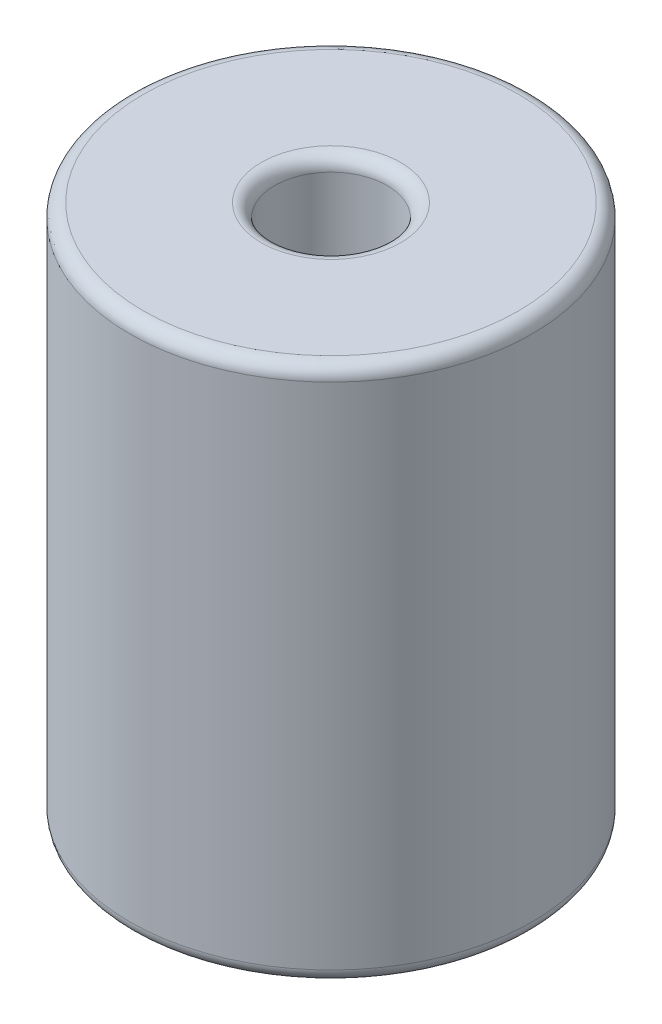
ISO-10303-21;
HEADER;
FILE_DESCRIPTION(('STEP AP214'),'2;1');
FILE_NAME('part.step','',(''),(''),'','','');
FILE_SCHEMA(('AUTOMOTIVE_DESIGN { 1 0 10303 214 1 1 1 1 }'));
ENDSEC;
DATA;
#1=APPLICATION_CONTEXT('core data for automotive mechanical design processes');
#2=APPLICATION_PROTOCOL_DEFINITION('international standard','automotive_design',2000,#1);
#3=PRODUCT_CONTEXT('',#1,'mechanical');
#4=PRODUCT('Part','Part','',(#3));
#5=PRODUCT_RELATED_PRODUCT_CATEGORY('part','',(#4));
#6=PRODUCT_DEFINITION_FORMATION('','',#4);
#7=PRODUCT_DEFINITION_CONTEXT('part definition',#1,'design');
#8=PRODUCT_DEFINITION('design','',#6,#7);
#9=PRODUCT_DEFINITION_SHAPE('','',#8);
#10=(LENGTH_UNIT() NAMED_UNIT(*) SI_UNIT(.MILLI.,.METRE.));
#11=(NAMED_UNIT(*) PLANE_ANGLE_UNIT() SI_UNIT($,.RADIAN.));
#12=(NAMED_UNIT(*) SI_UNIT($,.STERADIAN.) SOLID_ANGLE_UNIT());
#13=UNCERTAINTY_MEASURE_WITH_UNIT(LENGTH_MEASURE(1.E-05),#10,'distance_accuracy_value','');
#14=(GEOMETRIC_REPRESENTATION_CONTEXT(3) GLOBAL_UNCERTAINTY_ASSIGNED_CONTEXT((#13)) GLOBAL_UNIT_ASSIGNED_CONTEXT((#10,
#11,#12)) REPRESENTATION_CONTEXT('',''));
#15=CARTESIAN_POINT('',(0.,0.,0.));
#16=DIRECTION('',(0.,0.,1.));
#17=DIRECTION('',(1.,0.,0.));
#18=AXIS2_PLACEMENT_3D('',#15,#16,#17);
#19=CARTESIAN_POINT('',(0.,20.,0.));
#20=DIRECTION('',(0.,1.,0.));
#21=DIRECTION('',(0.,0.,1.));
#22=AXIS2_PLACEMENT_3D('',#19,#20,#21);
#23=PLANE('',#22);
#24=CARTESIAN_POINT('',(0.,20.,0.));
#25=DIRECTION('',(0.,1.,0.));
#26=DIRECTION('',(0.,0.,1.));
#27=AXIS2_PLACEMENT_3D('',#24,#25,#26);
#28=CIRCLE('',#27,2.6);
#29=CARTESIAN_POINT('',(0.,20.,2.6));
#30=VERTEX_POINT('',#29);
#31=EDGE_CURVE('E42',#30,#30,#28,.F.);
#32=ORIENTED_EDGE('',*,*,#31,.T.);
#33=EDGE_LOOP('',(#32));
#34=FACE_BOUND('',#33,.T.);
#35=CARTESIAN_POINT('',(0.,20.,0.));
#36=DIRECTION('',(0.,1.,0.));
#37=DIRECTION('',(0.,0.,1.));
#38=AXIS2_PLACEMENT_3D('',#35,#36,#37);
#39=CIRCLE('',#38,7.);
#40=CARTESIAN_POINT('',(0.,20.,7.));
#41=VERTEX_POINT('',#40);
#42=EDGE_CURVE('E46',#41,#41,#39,.T.);
#43=ORIENTED_EDGE('',*,*,#42,.T.);
#44=EDGE_LOOP('',(#43));
#45=FACE_BOUND('',#44,.T.);
#46=ADVANCED_FACE('F31',(#34,#45),#23,.T.);
#47=CARTESIAN_POINT('',(0.,0.,0.));
#48=DIRECTION('',(0.,1.,0.));
#49=DIRECTION('',(0.,0.,1.));
#50=AXIS2_PLACEMENT_3D('',#47,#48,#49);
#51=PLANE('',#50);
#52=CARTESIAN_POINT('',(0.,0.,0.));
#53=DIRECTION('',(0.,1.,0.));
#54=DIRECTION('',(0.,0.,1.));
#55=AXIS2_PLACEMENT_3D('',#52,#53,#54);
#56=CIRCLE('',#55,2.6);
#57=CARTESIAN_POINT('',(0.,0.,2.6));
#58=VERTEX_POINT('',#57);
#59=EDGE_CURVE('E57',#58,#58,#56,.T.);
#60=ORIENTED_EDGE('',*,*,#59,.T.);
#61=EDGE_LOOP('',(#60));
#62=FACE_BOUND('',#61,.T.);
#63=CARTESIAN_POINT('',(0.,0.,0.));
#64=DIRECTION('',(0.,1.,0.));
#65=DIRECTION('',(0.,0.,1.));
#66=AXIS2_PLACEMENT_3D('',#63,#64,#65);
#67=CIRCLE('',#66,7.);
#68=CARTESIAN_POINT('',(0.,0.,7.));
#69=VERTEX_POINT('',#68);
#70=EDGE_CURVE('E60',#69,#69,#67,.F.);
#71=ORIENTED_EDGE('',*,*,#70,.T.);
#72=EDGE_LOOP('',(#71));
#73=FACE_BOUND('',#72,.T.);
#74=ADVANCED_FACE('F64',(#62,#73),#51,.F.);
#75=CARTESIAN_POINT('',(0.,20.,0.));
#76=DIRECTION('',(0.,-1.,0.));
#77=DIRECTION('',(0.,0.,-1.));
#78=AXIS2_PLACEMENT_3D('',#75,#76,#77);
#79=CYLINDRICAL_SURFACE('',#78,7.5);
#80=CARTESIAN_POINT('',(0.,0.5,0.));
#81=DIRECTION('',(0.,1.,0.));
#82=DIRECTION('',(0.,0.,1.));
#83=AXIS2_PLACEMENT_3D('',#80,#81,#82);
#84=CIRCLE('',#83,7.5);
#85=CARTESIAN_POINT('',(0.,0.5,7.5));
#86=VERTEX_POINT('',#85);
#87=EDGE_CURVE('E10',#86,#86,#84,.T.);
#88=ORIENTED_EDGE('',*,*,#87,.T.);
#89=EDGE_LOOP('',(#88));
#90=FACE_BOUND('',#89,.T.);
#91=CARTESIAN_POINT('',(0.,19.5,0.));
#92=DIRECTION('',(0.,1.,0.));
#93=DIRECTION('',(0.,0.,1.));
#94=AXIS2_PLACEMENT_3D('',#91,#92,#93);
#95=CIRCLE('',#94,7.5);
#96=CARTESIAN_POINT('',(0.,19.5,7.5));
#97=VERTEX_POINT('',#96);
#98=EDGE_CURVE('E38',#97,#97,#95,.F.);
#99=ORIENTED_EDGE('',*,*,#98,.T.);
#100=EDGE_LOOP('',(#99));
#101=FACE_BOUND('',#100,.T.);
#102=ADVANCED_FACE('F84',(#90,#101),#79,.T.);
#103=CARTESIAN_POINT('',(0.,20.,0.));
#104=DIRECTION('',(0.,-1.,0.));
#105=DIRECTION('',(0.,0.,-1.));
#106=AXIS2_PLACEMENT_3D('',#103,#104,#105);
#107=CYLINDRICAL_SURFACE('',#106,2.1);
#108=CARTESIAN_POINT('',(0.,0.5,0.));
#109=DIRECTION('',(0.,1.,0.));
#110=DIRECTION('',(0.,0.,1.));
#111=AXIS2_PLACEMENT_3D('',#108,#109,#110);
#112=CIRCLE('',#111,2.1);
#113=CARTESIAN_POINT('',(0.,0.5,2.1));
#114=VERTEX_POINT('',#113);
#115=EDGE_CURVE('E51',#114,#114,#112,.F.);
#116=ORIENTED_EDGE('',*,*,#115,.T.);
#117=EDGE_LOOP('',(#116));
#118=FACE_BOUND('',#117,.T.);
#119=CARTESIAN_POINT('',(0.,19.5,0.));
#120=DIRECTION('',(0.,1.,0.));
#121=DIRECTION('',(0.,0.,1.));
#122=AXIS2_PLACEMENT_3D('',#119,#120,#121);
#123=CIRCLE('',#122,2.1);
#124=CARTESIAN_POINT('',(0.,19.5,2.1));
#125=VERTEX_POINT('',#124);
#126=EDGE_CURVE('E54',#125,#125,#123,.T.);
#127=ORIENTED_EDGE('',*,*,#126,.T.);
#128=EDGE_LOOP('',(#127));
#129=FACE_BOUND('',#128,.T.);
#130=ADVANCED_FACE('F89',(#118,#129),#107,.F.);
#131=CARTESIAN_POINT('',(0.,0.5,0.));
#132=DIRECTION('',(0.,1.,0.));
#133=DIRECTION('',(0.,0.,1.));
#134=AXIS2_PLACEMENT_3D('',#131,#132,#133);
#135=TOROIDAL_SURFACE('',#134,2.6,0.5);
#136=ORIENTED_EDGE('',*,*,#115,.F.);
#137=EDGE_LOOP('',(#136));
#138=FACE_BOUND('',#137,.T.);
#139=ORIENTED_EDGE('',*,*,#59,.F.);
#140=EDGE_LOOP('',(#139));
#141=FACE_BOUND('',#140,.T.);
#142=ADVANCED_FACE('F75',(#138,#141),#135,.T.);
#143=CARTESIAN_POINT('',(0.,19.5,0.));
#144=DIRECTION('',(0.,1.,0.));
#145=DIRECTION('',(0.,0.,1.));
#146=AXIS2_PLACEMENT_3D('',#143,#144,#145);
#147=TOROIDAL_SURFACE('',#146,2.6,0.5);
#148=ORIENTED_EDGE('',*,*,#31,.F.);
#149=EDGE_LOOP('',(#148));
#150=FACE_BOUND('',#149,.T.);
#151=ORIENTED_EDGE('',*,*,#126,.F.);
#152=EDGE_LOOP('',(#151));
#153=FACE_BOUND('',#152,.T.);
#154=ADVANCED_FACE('F69',(#150,#153),#147,.T.);
#155=CARTESIAN_POINT('',(0.,0.5,0.));
#156=DIRECTION('',(0.,1.,0.));
#157=DIRECTION('',(0.,0.,1.));
#158=AXIS2_PLACEMENT_3D('',#155,#156,#157);
#159=TOROIDAL_SURFACE('',#158,7.,0.5);
#160=ORIENTED_EDGE('',*,*,#70,.F.);
#161=EDGE_LOOP('',(#160));
#162=FACE_BOUND('',#161,.T.);
#163=ORIENTED_EDGE('',*,*,#87,.F.);
#164=EDGE_LOOP('',(#163));
#165=FACE_BOUND('',#164,.T.);
#166=ADVANCED_FACE('F66',(#162,#165),#159,.T.);
#167=CARTESIAN_POINT('',(0.,19.5,0.));
#168=DIRECTION('',(0.,1.,0.));
#169=DIRECTION('',(0.,0.,1.));
#170=AXIS2_PLACEMENT_3D('',#167,#168,#169);
#171=TOROIDAL_SURFACE('',#170,7.,0.5);
#172=ORIENTED_EDGE('',*,*,#98,.F.);
#173=EDGE_LOOP('',(#172));
#174=FACE_BOUND('',#173,.T.);
#175=ORIENTED_EDGE('',*,*,#42,.F.);
#176=EDGE_LOOP('',(#175));
#177=FACE_BOUND('',#176,.T.);
#178=ADVANCED_FACE('F33',(#174,#177),#171,.T.);
#179=CLOSED_SHELL('',(#46,#74,#102,#130,#142,#154,#166,#178));
#180=MANIFOLD_SOLID_BREP('B2',#179);
#181=ADVANCED_BREP_SHAPE_REPRESENTATION('',(#18,#180),#14);
#182=SHAPE_DEFINITION_REPRESENTATION(#9,#181);
ENDSEC;
END-ISO-10303-21;
